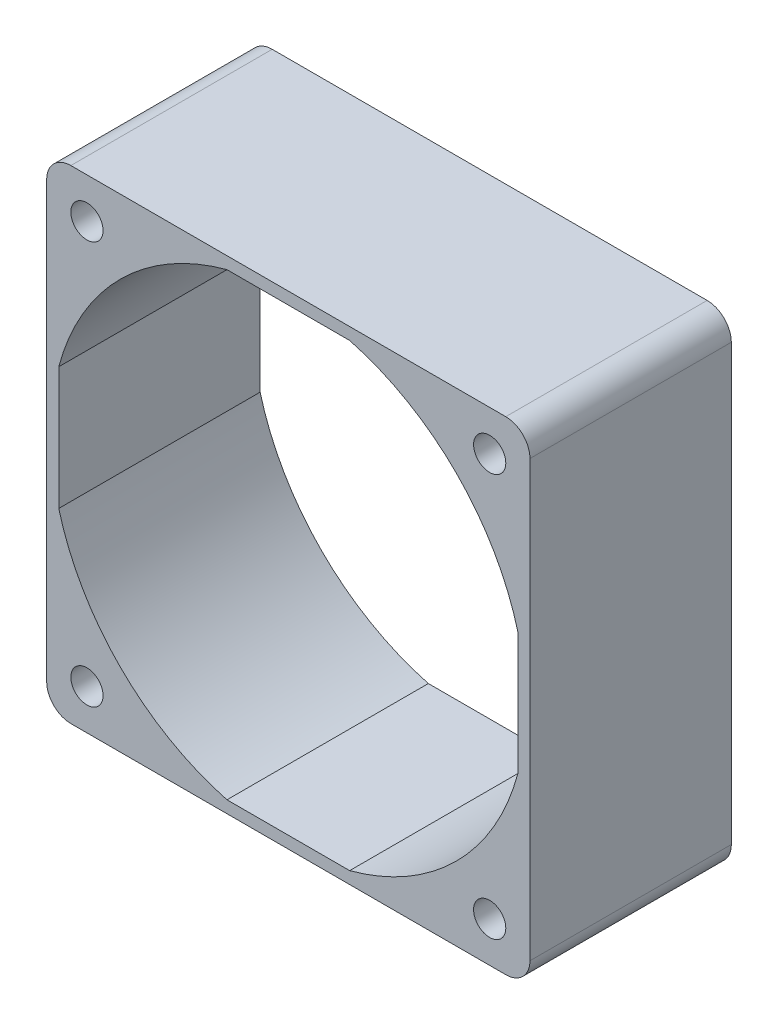
ISO-10303-21;
HEADER;
FILE_DESCRIPTION(('STEP AP214'),'2;1');
FILE_NAME('part.step','',(''),(''),'','','');
FILE_SCHEMA(('AUTOMOTIVE_DESIGN { 1 0 10303 214 1 1 1 1 }'));
ENDSEC;
DATA;
#1=APPLICATION_CONTEXT('core data for automotive mechanical design processes');
#2=APPLICATION_PROTOCOL_DEFINITION('international standard','automotive_design',2000,#1);
#3=PRODUCT_CONTEXT('',#1,'mechanical');
#4=PRODUCT('Part','Part','',(#3));
#5=PRODUCT_RELATED_PRODUCT_CATEGORY('part','',(#4));
#6=PRODUCT_DEFINITION_FORMATION('','',#4);
#7=PRODUCT_DEFINITION_CONTEXT('part definition',#1,'design');
#8=PRODUCT_DEFINITION('design','',#6,#7);
#9=PRODUCT_DEFINITION_SHAPE('','',#8);
#10=(LENGTH_UNIT() NAMED_UNIT(*) SI_UNIT(.MILLI.,.METRE.));
#11=(NAMED_UNIT(*) PLANE_ANGLE_UNIT() SI_UNIT($,.RADIAN.));
#12=(NAMED_UNIT(*) SI_UNIT($,.STERADIAN.) SOLID_ANGLE_UNIT());
#13=UNCERTAINTY_MEASURE_WITH_UNIT(LENGTH_MEASURE(1.E-05),#10,'distance_accuracy_value','');
#14=(GEOMETRIC_REPRESENTATION_CONTEXT(3) GLOBAL_UNCERTAINTY_ASSIGNED_CONTEXT((#13)) GLOBAL_UNIT_ASSIGNED_CONTEXT((#10,
#11,#12)) REPRESENTATION_CONTEXT('',''));
#15=CARTESIAN_POINT('',(0.,0.,0.));
#16=DIRECTION('',(0.,0.,1.));
#17=DIRECTION('',(1.,0.,0.));
#18=AXIS2_PLACEMENT_3D('',#15,#16,#17);
#19=CARTESIAN_POINT('',(-27.,-27.,25.));
#20=DIRECTION('',(0.,0.,-1.));
#21=DIRECTION('',(-1.,0.,0.));
#22=AXIS2_PLACEMENT_3D('',#19,#20,#21);
#23=PLANE('',#22);
#24=CARTESIAN_POINT('',(-27.,-27.,25.));
#25=DIRECTION('',(0.,0.,1.));
#26=DIRECTION('',(-1.,0.,0.));
#27=AXIS2_PLACEMENT_3D('',#24,#25,#26);
#28=CIRCLE('',#27,3.);
#29=CARTESIAN_POINT('',(-30.,-27.,25.));
#30=VERTEX_POINT('',#29);
#31=CARTESIAN_POINT('',(-27.,-30.,25.));
#32=VERTEX_POINT('',#31);
#33=EDGE_CURVE('E224',#30,#32,#28,.T.);
#34=ORIENTED_EDGE('',*,*,#33,.T.);
#35=DIRECTION('',(1.,0.,0.));
#36=VECTOR('',#35,1.);
#37=CARTESIAN_POINT('',(-27.,-30.,25.));
#38=LINE('',#37,#36);
#39=CARTESIAN_POINT('',(27.,-30.,25.));
#40=VERTEX_POINT('',#39);
#41=EDGE_CURVE('E227',#32,#40,#38,.T.);
#42=ORIENTED_EDGE('',*,*,#41,.T.);
#43=CARTESIAN_POINT('',(27.,-27.,25.));
#44=DIRECTION('',(0.,0.,1.));
#45=DIRECTION('',(1.,0.,0.));
#46=AXIS2_PLACEMENT_3D('',#43,#44,#45);
#47=CIRCLE('',#46,3.);
#48=CARTESIAN_POINT('',(30.,-27.,25.));
#49=VERTEX_POINT('',#48);
#50=EDGE_CURVE('E230',#40,#49,#47,.T.);
#51=ORIENTED_EDGE('',*,*,#50,.T.);
#52=DIRECTION('',(0.,1.,0.));
#53=VECTOR('',#52,1.);
#54=CARTESIAN_POINT('',(30.,27.,25.));
#55=LINE('',#54,#53);
#56=CARTESIAN_POINT('',(30.,27.,25.));
#57=VERTEX_POINT('',#56);
#58=EDGE_CURVE('E232',#49,#57,#55,.T.);
#59=ORIENTED_EDGE('',*,*,#58,.T.);
#60=CARTESIAN_POINT('',(27.,27.,25.));
#61=DIRECTION('',(0.,0.,1.));
#62=DIRECTION('',(1.,0.,0.));
#63=AXIS2_PLACEMENT_3D('',#60,#61,#62);
#64=CIRCLE('',#63,3.);
#65=CARTESIAN_POINT('',(27.,30.,25.));
#66=VERTEX_POINT('',#65);
#67=EDGE_CURVE('E234',#57,#66,#64,.T.);
#68=ORIENTED_EDGE('',*,*,#67,.T.);
#69=DIRECTION('',(-1.,0.,0.));
#70=VECTOR('',#69,1.);
#71=CARTESIAN_POINT('',(-27.,30.,25.));
#72=LINE('',#71,#70);
#73=CARTESIAN_POINT('',(-27.,30.,25.));
#74=VERTEX_POINT('',#73);
#75=EDGE_CURVE('E236',#66,#74,#72,.T.);
#76=ORIENTED_EDGE('',*,*,#75,.T.);
#77=CARTESIAN_POINT('',(-27.,27.,25.));
#78=DIRECTION('',(0.,0.,1.));
#79=DIRECTION('',(1.,0.,0.));
#80=AXIS2_PLACEMENT_3D('',#77,#78,#79);
#81=CIRCLE('',#80,3.);
#82=CARTESIAN_POINT('',(-30.,27.,25.));
#83=VERTEX_POINT('',#82);
#84=EDGE_CURVE('E238',#74,#83,#81,.T.);
#85=ORIENTED_EDGE('',*,*,#84,.T.);
#86=DIRECTION('',(0.,-1.,0.));
#87=VECTOR('',#86,1.);
#88=CARTESIAN_POINT('',(-30.,27.,25.));
#89=LINE('',#88,#87);
#90=EDGE_CURVE('E240',#83,#30,#89,.T.);
#91=ORIENTED_EDGE('',*,*,#90,.T.);
#92=EDGE_LOOP('',(#34,#42,#51,#59,#68,#76,#85,#91));
#93=FACE_BOUND('',#92,.T.);
#94=CARTESIAN_POINT('',(0.,0.,25.));
#95=DIRECTION('',(0.,0.,1.));
#96=DIRECTION('',(1.,0.,0.));
#97=AXIS2_PLACEMENT_3D('',#94,#95,#96);
#98=CIRCLE('',#97,29.5);
#99=CARTESIAN_POINT('',(7.61577310586391,-28.5,25.));
#100=VERTEX_POINT('',#99);
#101=CARTESIAN_POINT('',(28.5,-7.61577310586393,25.));
#102=VERTEX_POINT('',#101);
#103=EDGE_CURVE('E156',#100,#102,#98,.T.);
#104=ORIENTED_EDGE('',*,*,#103,.F.);
#105=DIRECTION('',(1.,0.,0.));
#106=VECTOR('',#105,1.);
#107=CARTESIAN_POINT('',(-7.61577310586391,-28.5,25.));
#108=LINE('',#107,#106);
#109=CARTESIAN_POINT('',(-7.6157731058639,-28.5,25.));
#110=VERTEX_POINT('',#109);
#111=EDGE_CURVE('E191',#110,#100,#108,.T.);
#112=ORIENTED_EDGE('',*,*,#111,.F.);
#113=CARTESIAN_POINT('',(0.,0.,25.));
#114=DIRECTION('',(0.,0.,1.));
#115=DIRECTION('',(1.,0.,0.));
#116=AXIS2_PLACEMENT_3D('',#113,#114,#115);
#117=CIRCLE('',#116,29.5);
#118=CARTESIAN_POINT('',(-28.5,-7.61577310586393,25.));
#119=VERTEX_POINT('',#118);
#120=EDGE_CURVE('E189',#119,#110,#117,.T.);
#121=ORIENTED_EDGE('',*,*,#120,.F.);
#122=DIRECTION('',(0.,-1.,0.));
#123=VECTOR('',#122,1.);
#124=CARTESIAN_POINT('',(-28.5,7.61577310586393,25.));
#125=LINE('',#124,#123);
#126=CARTESIAN_POINT('',(-28.5,7.61577310586393,25.));
#127=VERTEX_POINT('',#126);
#128=EDGE_CURVE('E187',#127,#119,#125,.T.);
#129=ORIENTED_EDGE('',*,*,#128,.F.);
#130=CARTESIAN_POINT('',(0.,0.,25.));
#131=DIRECTION('',(0.,0.,1.));
#132=DIRECTION('',(1.,0.,0.));
#133=AXIS2_PLACEMENT_3D('',#130,#131,#132);
#134=CIRCLE('',#133,29.5);
#135=CARTESIAN_POINT('',(-7.61577310586393,28.5,25.));
#136=VERTEX_POINT('',#135);
#137=EDGE_CURVE('E185',#136,#127,#134,.T.);
#138=ORIENTED_EDGE('',*,*,#137,.F.);
#139=DIRECTION('',(-1.,0.,0.));
#140=VECTOR('',#139,1.);
#141=CARTESIAN_POINT('',(-7.61577310586393,28.5,25.));
#142=LINE('',#141,#140);
#143=CARTESIAN_POINT('',(7.61577310586393,28.5,25.));
#144=VERTEX_POINT('',#143);
#145=EDGE_CURVE('E180',#144,#136,#142,.T.);
#146=ORIENTED_EDGE('',*,*,#145,.F.);
#147=CARTESIAN_POINT('',(0.,0.,25.));
#148=DIRECTION('',(0.,0.,1.));
#149=DIRECTION('',(1.,0.,0.));
#150=AXIS2_PLACEMENT_3D('',#147,#148,#149);
#151=CIRCLE('',#150,29.5);
#152=CARTESIAN_POINT('',(28.5,7.61577310586393,25.));
#153=VERTEX_POINT('',#152);
#154=EDGE_CURVE('E178',#153,#144,#151,.T.);
#155=ORIENTED_EDGE('',*,*,#154,.F.);
#156=DIRECTION('',(0.,1.,0.));
#157=VECTOR('',#156,1.);
#158=CARTESIAN_POINT('',(28.5,7.61577310586393,25.));
#159=LINE('',#158,#157);
#160=EDGE_CURVE('E164',#102,#153,#159,.T.);
#161=ORIENTED_EDGE('',*,*,#160,.F.);
#162=EDGE_LOOP('',(#104,#112,#121,#129,#138,#146,#155,#161));
#163=FACE_BOUND('',#162,.T.);
#164=CARTESIAN_POINT('',(-25.,25.,25.));
#165=DIRECTION('',(0.,0.,1.));
#166=DIRECTION('',(1.,0.,0.));
#167=AXIS2_PLACEMENT_3D('',#164,#165,#166);
#168=CIRCLE('',#167,2.);
#169=CARTESIAN_POINT('',(-23.,25.,25.));
#170=VERTEX_POINT('',#169);
#171=EDGE_CURVE('E194',#170,#170,#168,.T.);
#172=ORIENTED_EDGE('',*,*,#171,.F.);
#173=EDGE_LOOP('',(#172));
#174=FACE_BOUND('',#173,.T.);
#175=CARTESIAN_POINT('',(25.,25.,25.));
#176=DIRECTION('',(0.,0.,1.));
#177=DIRECTION('',(1.,0.,0.));
#178=AXIS2_PLACEMENT_3D('',#175,#176,#177);
#179=CIRCLE('',#178,2.);
#180=CARTESIAN_POINT('',(27.,25.,25.));
#181=VERTEX_POINT('',#180);
#182=EDGE_CURVE('E402',#181,#181,#179,.T.);
#183=ORIENTED_EDGE('',*,*,#182,.F.);
#184=EDGE_LOOP('',(#183));
#185=FACE_BOUND('',#184,.T.);
#186=CARTESIAN_POINT('',(25.,-25.,25.));
#187=DIRECTION('',(0.,0.,1.));
#188=DIRECTION('',(1.,0.,0.));
#189=AXIS2_PLACEMENT_3D('',#186,#187,#188);
#190=CIRCLE('',#189,2.);
#191=CARTESIAN_POINT('',(27.,-25.,25.));
#192=VERTEX_POINT('',#191);
#193=EDGE_CURVE('E396',#192,#192,#190,.T.);
#194=ORIENTED_EDGE('',*,*,#193,.F.);
#195=EDGE_LOOP('',(#194));
#196=FACE_BOUND('',#195,.T.);
#197=CARTESIAN_POINT('',(-25.,-25.,25.));
#198=DIRECTION('',(0.,0.,1.));
#199=DIRECTION('',(1.,0.,0.));
#200=AXIS2_PLACEMENT_3D('',#197,#198,#199);
#201=CIRCLE('',#200,2.00000000000001);
#202=CARTESIAN_POINT('',(-23.,-25.,25.));
#203=VERTEX_POINT('',#202);
#204=EDGE_CURVE('E387',#203,#203,#201,.T.);
#205=ORIENTED_EDGE('',*,*,#204,.F.);
#206=EDGE_LOOP('',(#205));
#207=FACE_BOUND('',#206,.T.);
#208=ADVANCED_FACE('F43',(#93,#163,#174,#185,#196,#207),#23,.F.);
#209=CARTESIAN_POINT('',(-27.,-27.,0.));
#210=DIRECTION('',(0.,0.,-1.));
#211=DIRECTION('',(-1.,0.,0.));
#212=AXIS2_PLACEMENT_3D('',#209,#210,#211);
#213=PLANE('',#212);
#214=CARTESIAN_POINT('',(25.,-25.,0.));
#215=DIRECTION('',(0.,0.,1.));
#216=DIRECTION('',(1.,0.,0.));
#217=AXIS2_PLACEMENT_3D('',#214,#215,#216);
#218=CIRCLE('',#217,2.);
#219=CARTESIAN_POINT('',(27.,-25.,0.));
#220=VERTEX_POINT('',#219);
#221=EDGE_CURVE('E393',#220,#220,#218,.T.);
#222=ORIENTED_EDGE('',*,*,#221,.T.);
#223=EDGE_LOOP('',(#222));
#224=FACE_BOUND('',#223,.T.);
#225=CARTESIAN_POINT('',(-25.,25.,0.));
#226=DIRECTION('',(0.,0.,1.));
#227=DIRECTION('',(1.,0.,0.));
#228=AXIS2_PLACEMENT_3D('',#225,#226,#227);
#229=CIRCLE('',#228,2.);
#230=CARTESIAN_POINT('',(-23.,25.,0.));
#231=VERTEX_POINT('',#230);
#232=EDGE_CURVE('E405',#231,#231,#229,.T.);
#233=ORIENTED_EDGE('',*,*,#232,.T.);
#234=EDGE_LOOP('',(#233));
#235=FACE_BOUND('',#234,.T.);
#236=CARTESIAN_POINT('',(-27.,-27.,0.));
#237=DIRECTION('',(0.,0.,1.));
#238=DIRECTION('',(-1.,0.,0.));
#239=AXIS2_PLACEMENT_3D('',#236,#237,#238);
#240=CIRCLE('',#239,3.);
#241=CARTESIAN_POINT('',(-30.,-27.,0.));
#242=VERTEX_POINT('',#241);
#243=CARTESIAN_POINT('',(-27.,-30.,0.));
#244=VERTEX_POINT('',#243);
#245=EDGE_CURVE('E172',#242,#244,#240,.T.);
#246=ORIENTED_EDGE('',*,*,#245,.F.);
#247=DIRECTION('',(0.,-1.,0.));
#248=VECTOR('',#247,1.);
#249=CARTESIAN_POINT('',(-30.,27.,0.));
#250=LINE('',#249,#248);
#251=CARTESIAN_POINT('',(-30.,27.,0.));
#252=VERTEX_POINT('',#251);
#253=EDGE_CURVE('E228',#252,#242,#250,.T.);
#254=ORIENTED_EDGE('',*,*,#253,.F.);
#255=CARTESIAN_POINT('',(-27.,27.,0.));
#256=DIRECTION('',(0.,0.,1.));
#257=DIRECTION('',(1.,0.,0.));
#258=AXIS2_PLACEMENT_3D('',#255,#256,#257);
#259=CIRCLE('',#258,3.);
#260=CARTESIAN_POINT('',(-27.,30.,0.));
#261=VERTEX_POINT('',#260);
#262=EDGE_CURVE('E255',#261,#252,#259,.T.);
#263=ORIENTED_EDGE('',*,*,#262,.F.);
#264=DIRECTION('',(-1.,0.,0.));
#265=VECTOR('',#264,1.);
#266=CARTESIAN_POINT('',(-27.,30.,0.));
#267=LINE('',#266,#265);
#268=CARTESIAN_POINT('',(27.,30.,0.));
#269=VERTEX_POINT('',#268);
#270=EDGE_CURVE('E253',#269,#261,#267,.T.);
#271=ORIENTED_EDGE('',*,*,#270,.F.);
#272=CARTESIAN_POINT('',(27.,27.,0.));
#273=DIRECTION('',(0.,0.,1.));
#274=DIRECTION('',(1.,0.,0.));
#275=AXIS2_PLACEMENT_3D('',#272,#273,#274);
#276=CIRCLE('',#275,3.);
#277=CARTESIAN_POINT('',(30.,27.,0.));
#278=VERTEX_POINT('',#277);
#279=EDGE_CURVE('E251',#278,#269,#276,.T.);
#280=ORIENTED_EDGE('',*,*,#279,.F.);
#281=DIRECTION('',(0.,1.,0.));
#282=VECTOR('',#281,1.);
#283=CARTESIAN_POINT('',(30.,27.,0.));
#284=LINE('',#283,#282);
#285=CARTESIAN_POINT('',(30.,-27.,0.));
#286=VERTEX_POINT('',#285);
#287=EDGE_CURVE('E249',#286,#278,#284,.T.);
#288=ORIENTED_EDGE('',*,*,#287,.F.);
#289=CARTESIAN_POINT('',(27.,-27.,0.));
#290=DIRECTION('',(0.,0.,1.));
#291=DIRECTION('',(1.,0.,0.));
#292=AXIS2_PLACEMENT_3D('',#289,#290,#291);
#293=CIRCLE('',#292,3.);
#294=CARTESIAN_POINT('',(27.,-30.,0.));
#295=VERTEX_POINT('',#294);
#296=EDGE_CURVE('E247',#295,#286,#293,.T.);
#297=ORIENTED_EDGE('',*,*,#296,.F.);
#298=DIRECTION('',(1.,0.,0.));
#299=VECTOR('',#298,1.);
#300=CARTESIAN_POINT('',(-27.,-30.,0.));
#301=LINE('',#300,#299);
#302=EDGE_CURVE('E245',#244,#295,#301,.T.);
#303=ORIENTED_EDGE('',*,*,#302,.F.);
#304=EDGE_LOOP('',(#246,#254,#263,#271,#280,#288,#297,#303));
#305=FACE_BOUND('',#304,.T.);
#306=DIRECTION('',(1.,0.,0.));
#307=VECTOR('',#306,1.);
#308=CARTESIAN_POINT('',(-7.61577310586391,-28.5,0.));
#309=LINE('',#308,#307);
#310=CARTESIAN_POINT('',(-7.61577310586391,-28.5,0.));
#311=VERTEX_POINT('',#310);
#312=CARTESIAN_POINT('',(7.61577310586391,-28.5,0.));
#313=VERTEX_POINT('',#312);
#314=EDGE_CURVE('E165',#311,#313,#309,.T.);
#315=ORIENTED_EDGE('',*,*,#314,.T.);
#316=CARTESIAN_POINT('',(0.,0.,0.));
#317=DIRECTION('',(0.,0.,1.));
#318=DIRECTION('',(1.,0.,0.));
#319=AXIS2_PLACEMENT_3D('',#316,#317,#318);
#320=CIRCLE('',#319,29.5);
#321=CARTESIAN_POINT('',(28.5,-7.61577310586393,0.));
#322=VERTEX_POINT('',#321);
#323=EDGE_CURVE('E66',#313,#322,#320,.T.);
#324=ORIENTED_EDGE('',*,*,#323,.T.);
#325=DIRECTION('',(0.,1.,0.));
#326=VECTOR('',#325,1.);
#327=CARTESIAN_POINT('',(28.5,7.61577310586393,0.));
#328=LINE('',#327,#326);
#329=CARTESIAN_POINT('',(28.5,7.61577310586393,0.));
#330=VERTEX_POINT('',#329);
#331=EDGE_CURVE('E171',#322,#330,#328,.T.);
#332=ORIENTED_EDGE('',*,*,#331,.T.);
#333=CARTESIAN_POINT('',(0.,0.,0.));
#334=DIRECTION('',(0.,0.,1.));
#335=DIRECTION('',(1.,0.,0.));
#336=AXIS2_PLACEMENT_3D('',#333,#334,#335);
#337=CIRCLE('',#336,29.5);
#338=CARTESIAN_POINT('',(7.61577310586393,28.5,0.));
#339=VERTEX_POINT('',#338);
#340=EDGE_CURVE('E196',#330,#339,#337,.T.);
#341=ORIENTED_EDGE('',*,*,#340,.T.);
#342=DIRECTION('',(-1.,0.,0.));
#343=VECTOR('',#342,1.);
#344=CARTESIAN_POINT('',(-7.61577310586393,28.5,0.));
#345=LINE('',#344,#343);
#346=CARTESIAN_POINT('',(-7.61577310586393,28.5,0.));
#347=VERTEX_POINT('',#346);
#348=EDGE_CURVE('E199',#339,#347,#345,.T.);
#349=ORIENTED_EDGE('',*,*,#348,.T.);
#350=CARTESIAN_POINT('',(0.,0.,0.));
#351=DIRECTION('',(0.,0.,1.));
#352=DIRECTION('',(1.,0.,0.));
#353=AXIS2_PLACEMENT_3D('',#350,#351,#352);
#354=CIRCLE('',#353,29.5);
#355=CARTESIAN_POINT('',(-28.5,7.61577310586393,0.));
#356=VERTEX_POINT('',#355);
#357=EDGE_CURVE('E202',#347,#356,#354,.T.);
#358=ORIENTED_EDGE('',*,*,#357,.T.);
#359=DIRECTION('',(0.,-1.,0.));
#360=VECTOR('',#359,1.);
#361=CARTESIAN_POINT('',(-28.5,7.61577310586393,0.));
#362=LINE('',#361,#360);
#363=CARTESIAN_POINT('',(-28.5,-7.61577310586393,0.));
#364=VERTEX_POINT('',#363);
#365=EDGE_CURVE('E205',#356,#364,#362,.T.);
#366=ORIENTED_EDGE('',*,*,#365,.T.);
#367=CARTESIAN_POINT('',(0.,0.,0.));
#368=DIRECTION('',(0.,0.,1.));
#369=DIRECTION('',(1.,0.,0.));
#370=AXIS2_PLACEMENT_3D('',#367,#368,#369);
#371=CIRCLE('',#370,29.5);
#372=EDGE_CURVE('E208',#364,#311,#371,.T.);
#373=ORIENTED_EDGE('',*,*,#372,.T.);
#374=EDGE_LOOP('',(#315,#324,#332,#341,#349,#358,#366,#373));
#375=FACE_BOUND('',#374,.T.);
#376=CARTESIAN_POINT('',(25.,25.,0.));
#377=DIRECTION('',(0.,0.,1.));
#378=DIRECTION('',(1.,0.,0.));
#379=AXIS2_PLACEMENT_3D('',#376,#377,#378);
#380=CIRCLE('',#379,2.);
#381=CARTESIAN_POINT('',(27.,25.,0.));
#382=VERTEX_POINT('',#381);
#383=EDGE_CURVE('E399',#382,#382,#380,.T.);
#384=ORIENTED_EDGE('',*,*,#383,.T.);
#385=EDGE_LOOP('',(#384));
#386=FACE_BOUND('',#385,.T.);
#387=CARTESIAN_POINT('',(-25.,-25.,0.));
#388=DIRECTION('',(0.,0.,1.));
#389=DIRECTION('',(1.,0.,0.));
#390=AXIS2_PLACEMENT_3D('',#387,#388,#389);
#391=CIRCLE('',#390,2.00000000000001);
#392=CARTESIAN_POINT('',(-23.,-25.,0.));
#393=VERTEX_POINT('',#392);
#394=EDGE_CURVE('E390',#393,#393,#391,.T.);
#395=ORIENTED_EDGE('',*,*,#394,.T.);
#396=EDGE_LOOP('',(#395));
#397=FACE_BOUND('',#396,.T.);
#398=ADVANCED_FACE('F285',(#224,#235,#305,#375,#386,#397),#213,.T.);
#399=CARTESIAN_POINT('',(-27.,-27.,25.));
#400=DIRECTION('',(0.,0.,-1.));
#401=DIRECTION('',(-1.,0.,0.));
#402=AXIS2_PLACEMENT_3D('',#399,#400,#401);
#403=CYLINDRICAL_SURFACE('',#402,3.);
#404=ORIENTED_EDGE('',*,*,#245,.T.);
#405=DIRECTION('',(0.,0.,-1.));
#406=VECTOR('',#405,1.);
#407=CARTESIAN_POINT('',(-27.,-30.,25.));
#408=LINE('',#407,#406);
#409=EDGE_CURVE('E11',#32,#244,#408,.T.);
#410=ORIENTED_EDGE('',*,*,#409,.F.);
#411=ORIENTED_EDGE('',*,*,#33,.F.);
#412=DIRECTION('',(0.,0.,-1.));
#413=VECTOR('',#412,1.);
#414=CARTESIAN_POINT('',(-30.,-27.,25.));
#415=LINE('',#414,#413);
#416=EDGE_CURVE('E242',#30,#242,#415,.T.);
#417=ORIENTED_EDGE('',*,*,#416,.T.);
#418=EDGE_LOOP('',(#404,#410,#411,#417));
#419=FACE_BOUND('',#418,.T.);
#420=ADVANCED_FACE('F45',(#419),#403,.T.);
#421=CARTESIAN_POINT('',(-27.,-30.,25.));
#422=DIRECTION('',(0.,1.,0.));
#423=DIRECTION('',(-1.,0.,0.));
#424=AXIS2_PLACEMENT_3D('',#421,#422,#423);
#425=PLANE('',#424);
#426=ORIENTED_EDGE('',*,*,#302,.T.);
#427=DIRECTION('',(0.,0.,-1.));
#428=VECTOR('',#427,1.);
#429=CARTESIAN_POINT('',(27.,-30.,25.));
#430=LINE('',#429,#428);
#431=EDGE_CURVE('E51',#40,#295,#430,.T.);
#432=ORIENTED_EDGE('',*,*,#431,.F.);
#433=ORIENTED_EDGE('',*,*,#41,.F.);
#434=ORIENTED_EDGE('',*,*,#409,.T.);
#435=EDGE_LOOP('',(#426,#432,#433,#434));
#436=FACE_BOUND('',#435,.T.);
#437=ADVANCED_FACE('F302',(#436),#425,.F.);
#438=CARTESIAN_POINT('',(27.,-27.,25.));
#439=DIRECTION('',(0.,0.,-1.));
#440=DIRECTION('',(-1.,0.,0.));
#441=AXIS2_PLACEMENT_3D('',#438,#439,#440);
#442=CYLINDRICAL_SURFACE('',#441,3.);
#443=ORIENTED_EDGE('',*,*,#296,.T.);
#444=DIRECTION('',(0.,0.,-1.));
#445=VECTOR('',#444,1.);
#446=CARTESIAN_POINT('',(30.,-27.,25.));
#447=LINE('',#446,#445);
#448=EDGE_CURVE('E272',#49,#286,#447,.T.);
#449=ORIENTED_EDGE('',*,*,#448,.F.);
#450=ORIENTED_EDGE('',*,*,#50,.F.);
#451=ORIENTED_EDGE('',*,*,#431,.T.);
#452=EDGE_LOOP('',(#443,#449,#450,#451));
#453=FACE_BOUND('',#452,.T.);
#454=ADVANCED_FACE('F279',(#453),#442,.T.);
#455=CARTESIAN_POINT('',(30.,27.,25.));
#456=DIRECTION('',(-1.,0.,0.));
#457=DIRECTION('',(0.,0.,1.));
#458=AXIS2_PLACEMENT_3D('',#455,#456,#457);
#459=PLANE('',#458);
#460=ORIENTED_EDGE('',*,*,#287,.T.);
#461=DIRECTION('',(0.,0.,-1.));
#462=VECTOR('',#461,1.);
#463=CARTESIAN_POINT('',(30.,27.,25.));
#464=LINE('',#463,#462);
#465=EDGE_CURVE('E269',#57,#278,#464,.T.);
#466=ORIENTED_EDGE('',*,*,#465,.F.);
#467=ORIENTED_EDGE('',*,*,#58,.F.);
#468=ORIENTED_EDGE('',*,*,#448,.T.);
#469=EDGE_LOOP('',(#460,#466,#467,#468));
#470=FACE_BOUND('',#469,.T.);
#471=ADVANCED_FACE('F291',(#470),#459,.F.);
#472=CARTESIAN_POINT('',(27.,27.,25.));
#473=DIRECTION('',(0.,0.,-1.));
#474=DIRECTION('',(-1.,0.,0.));
#475=AXIS2_PLACEMENT_3D('',#472,#473,#474);
#476=CYLINDRICAL_SURFACE('',#475,3.);
#477=ORIENTED_EDGE('',*,*,#279,.T.);
#478=DIRECTION('',(0.,0.,-1.));
#479=VECTOR('',#478,1.);
#480=CARTESIAN_POINT('',(27.,30.,25.));
#481=LINE('',#480,#479);
#482=EDGE_CURVE('E266',#66,#269,#481,.T.);
#483=ORIENTED_EDGE('',*,*,#482,.F.);
#484=ORIENTED_EDGE('',*,*,#67,.F.);
#485=ORIENTED_EDGE('',*,*,#465,.T.);
#486=EDGE_LOOP('',(#477,#483,#484,#485));
#487=FACE_BOUND('',#486,.T.);
#488=ADVANCED_FACE('F295',(#487),#476,.T.);
#489=CARTESIAN_POINT('',(-27.,30.,25.));
#490=DIRECTION('',(0.,-1.,0.));
#491=DIRECTION('',(1.,0.,0.));
#492=AXIS2_PLACEMENT_3D('',#489,#490,#491);
#493=PLANE('',#492);
#494=ORIENTED_EDGE('',*,*,#270,.T.);
#495=DIRECTION('',(0.,0.,-1.));
#496=VECTOR('',#495,1.);
#497=CARTESIAN_POINT('',(-27.,30.,25.));
#498=LINE('',#497,#496);
#499=EDGE_CURVE('E263',#74,#261,#498,.T.);
#500=ORIENTED_EDGE('',*,*,#499,.F.);
#501=ORIENTED_EDGE('',*,*,#75,.F.);
#502=ORIENTED_EDGE('',*,*,#482,.T.);
#503=EDGE_LOOP('',(#494,#500,#501,#502));
#504=FACE_BOUND('',#503,.T.);
#505=ADVANCED_FACE('F315',(#504),#493,.F.);
#506=CARTESIAN_POINT('',(-27.,27.,25.));
#507=DIRECTION('',(0.,0.,-1.));
#508=DIRECTION('',(-1.,0.,0.));
#509=AXIS2_PLACEMENT_3D('',#506,#507,#508);
#510=CYLINDRICAL_SURFACE('',#509,3.);
#511=ORIENTED_EDGE('',*,*,#262,.T.);
#512=DIRECTION('',(0.,0.,-1.));
#513=VECTOR('',#512,1.);
#514=CARTESIAN_POINT('',(-30.,27.,25.));
#515=LINE('',#514,#513);
#516=EDGE_CURVE('E260',#83,#252,#515,.T.);
#517=ORIENTED_EDGE('',*,*,#516,.F.);
#518=ORIENTED_EDGE('',*,*,#84,.F.);
#519=ORIENTED_EDGE('',*,*,#499,.T.);
#520=EDGE_LOOP('',(#511,#517,#518,#519));
#521=FACE_BOUND('',#520,.T.);
#522=ADVANCED_FACE('F313',(#521),#510,.T.);
#523=CARTESIAN_POINT('',(-30.,27.,25.));
#524=DIRECTION('',(1.,0.,0.));
#525=DIRECTION('',(0.,0.,-1.));
#526=AXIS2_PLACEMENT_3D('',#523,#524,#525);
#527=PLANE('',#526);
#528=ORIENTED_EDGE('',*,*,#253,.T.);
#529=ORIENTED_EDGE('',*,*,#416,.F.);
#530=ORIENTED_EDGE('',*,*,#90,.F.);
#531=ORIENTED_EDGE('',*,*,#516,.T.);
#532=EDGE_LOOP('',(#528,#529,#530,#531));
#533=FACE_BOUND('',#532,.T.);
#534=ADVANCED_FACE('F308',(#533),#527,.F.);
#535=CARTESIAN_POINT('',(0.,0.,25.));
#536=DIRECTION('',(0.,0.,-1.));
#537=DIRECTION('',(-1.,0.,0.));
#538=AXIS2_PLACEMENT_3D('',#535,#536,#537);
#539=CYLINDRICAL_SURFACE('',#538,29.5);
#540=ORIENTED_EDGE('',*,*,#323,.F.);
#541=DIRECTION('',(0.,0.,-1.));
#542=VECTOR('',#541,1.);
#543=CARTESIAN_POINT('',(7.61577310586391,-28.5,25.));
#544=LINE('',#543,#542);
#545=EDGE_CURVE('E160',#100,#313,#544,.T.);
#546=ORIENTED_EDGE('',*,*,#545,.F.);
#547=ORIENTED_EDGE('',*,*,#103,.T.);
#548=DIRECTION('',(0.,0.,-1.));
#549=VECTOR('',#548,1.);
#550=CARTESIAN_POINT('',(28.5,-7.61577310586393,25.));
#551=LINE('',#550,#549);
#552=EDGE_CURVE('E159',#102,#322,#551,.T.);
#553=ORIENTED_EDGE('',*,*,#552,.T.);
#554=EDGE_LOOP('',(#540,#546,#547,#553));
#555=FACE_BOUND('',#554,.T.);
#556=ADVANCED_FACE('F158',(#555),#539,.F.);
#557=CARTESIAN_POINT('',(28.5,7.61577310586393,25.));
#558=DIRECTION('',(-1.,0.,0.));
#559=DIRECTION('',(0.,0.,1.));
#560=AXIS2_PLACEMENT_3D('',#557,#558,#559);
#561=PLANE('',#560);
#562=ORIENTED_EDGE('',*,*,#331,.F.);
#563=ORIENTED_EDGE('',*,*,#552,.F.);
#564=ORIENTED_EDGE('',*,*,#160,.T.);
#565=DIRECTION('',(0.,0.,-1.));
#566=VECTOR('',#565,1.);
#567=CARTESIAN_POINT('',(28.5,7.61577310586393,25.));
#568=LINE('',#567,#566);
#569=EDGE_CURVE('E173',#153,#330,#568,.T.);
#570=ORIENTED_EDGE('',*,*,#569,.T.);
#571=EDGE_LOOP('',(#562,#563,#564,#570));
#572=FACE_BOUND('',#571,.T.);
#573=ADVANCED_FACE('F168',(#572),#561,.T.);
#574=CARTESIAN_POINT('',(0.,0.,25.));
#575=DIRECTION('',(0.,0.,-1.));
#576=DIRECTION('',(-1.,0.,0.));
#577=AXIS2_PLACEMENT_3D('',#574,#575,#576);
#578=CYLINDRICAL_SURFACE('',#577,29.5);
#579=ORIENTED_EDGE('',*,*,#340,.F.);
#580=ORIENTED_EDGE('',*,*,#569,.F.);
#581=ORIENTED_EDGE('',*,*,#154,.T.);
#582=DIRECTION('',(0.,0.,-1.));
#583=VECTOR('',#582,1.);
#584=CARTESIAN_POINT('',(7.61577310586393,28.5,25.));
#585=LINE('',#584,#583);
#586=EDGE_CURVE('E221',#144,#339,#585,.T.);
#587=ORIENTED_EDGE('',*,*,#586,.T.);
#588=EDGE_LOOP('',(#579,#580,#581,#587));
#589=FACE_BOUND('',#588,.T.);
#590=ADVANCED_FACE('F341',(#589),#578,.F.);
#591=CARTESIAN_POINT('',(-7.61577310586393,28.5,25.));
#592=DIRECTION('',(0.,-1.,0.));
#593=DIRECTION('',(0.,0.,-1.));
#594=AXIS2_PLACEMENT_3D('',#591,#592,#593);
#595=PLANE('',#594);
#596=ORIENTED_EDGE('',*,*,#348,.F.);
#597=ORIENTED_EDGE('',*,*,#586,.F.);
#598=ORIENTED_EDGE('',*,*,#145,.T.);
#599=DIRECTION('',(0.,0.,-1.));
#600=VECTOR('',#599,1.);
#601=CARTESIAN_POINT('',(-7.61577310586393,28.5,25.));
#602=LINE('',#601,#600);
#603=EDGE_CURVE('E219',#136,#347,#602,.T.);
#604=ORIENTED_EDGE('',*,*,#603,.T.);
#605=EDGE_LOOP('',(#596,#597,#598,#604));
#606=FACE_BOUND('',#605,.T.);
#607=ADVANCED_FACE('F345',(#606),#595,.T.);
#608=CARTESIAN_POINT('',(0.,0.,25.));
#609=DIRECTION('',(0.,0.,-1.));
#610=DIRECTION('',(-1.,0.,0.));
#611=AXIS2_PLACEMENT_3D('',#608,#609,#610);
#612=CYLINDRICAL_SURFACE('',#611,29.5);
#613=ORIENTED_EDGE('',*,*,#357,.F.);
#614=ORIENTED_EDGE('',*,*,#603,.F.);
#615=ORIENTED_EDGE('',*,*,#137,.T.);
#616=DIRECTION('',(0.,0.,-1.));
#617=VECTOR('',#616,1.);
#618=CARTESIAN_POINT('',(-28.5,7.61577310586393,25.));
#619=LINE('',#618,#617);
#620=EDGE_CURVE('E217',#127,#356,#619,.T.);
#621=ORIENTED_EDGE('',*,*,#620,.T.);
#622=EDGE_LOOP('',(#613,#614,#615,#621));
#623=FACE_BOUND('',#622,.T.);
#624=ADVANCED_FACE('F351',(#623),#612,.F.);
#625=CARTESIAN_POINT('',(-28.5,7.61577310586393,25.));
#626=DIRECTION('',(1.,0.,0.));
#627=DIRECTION('',(0.,0.,-1.));
#628=AXIS2_PLACEMENT_3D('',#625,#626,#627);
#629=PLANE('',#628);
#630=ORIENTED_EDGE('',*,*,#365,.F.);
#631=ORIENTED_EDGE('',*,*,#620,.F.);
#632=ORIENTED_EDGE('',*,*,#128,.T.);
#633=DIRECTION('',(0.,0.,-1.));
#634=VECTOR('',#633,1.);
#635=CARTESIAN_POINT('',(-28.5,-7.61577310586393,25.));
#636=LINE('',#635,#634);
#637=EDGE_CURVE('E215',#119,#364,#636,.T.);
#638=ORIENTED_EDGE('',*,*,#637,.T.);
#639=EDGE_LOOP('',(#630,#631,#632,#638));
#640=FACE_BOUND('',#639,.T.);
#641=ADVANCED_FACE('F355',(#640),#629,.T.);
#642=CARTESIAN_POINT('',(0.,0.,25.));
#643=DIRECTION('',(0.,0.,-1.));
#644=DIRECTION('',(-1.,0.,0.));
#645=AXIS2_PLACEMENT_3D('',#642,#643,#644);
#646=CYLINDRICAL_SURFACE('',#645,29.5);
#647=ORIENTED_EDGE('',*,*,#372,.F.);
#648=ORIENTED_EDGE('',*,*,#637,.F.);
#649=ORIENTED_EDGE('',*,*,#120,.T.);
#650=DIRECTION('',(0.,0.,-1.));
#651=VECTOR('',#650,1.);
#652=CARTESIAN_POINT('',(-7.61577310586391,-28.5,25.));
#653=LINE('',#652,#651);
#654=EDGE_CURVE('E58',#110,#311,#653,.T.);
#655=ORIENTED_EDGE('',*,*,#654,.T.);
#656=EDGE_LOOP('',(#647,#648,#649,#655));
#657=FACE_BOUND('',#656,.T.);
#658=ADVANCED_FACE('F359',(#657),#646,.F.);
#659=CARTESIAN_POINT('',(-7.61577310586391,-28.5,25.));
#660=DIRECTION('',(0.,1.,0.));
#661=DIRECTION('',(0.,0.,1.));
#662=AXIS2_PLACEMENT_3D('',#659,#660,#661);
#663=PLANE('',#662);
#664=ORIENTED_EDGE('',*,*,#314,.F.);
#665=ORIENTED_EDGE('',*,*,#654,.F.);
#666=ORIENTED_EDGE('',*,*,#111,.T.);
#667=ORIENTED_EDGE('',*,*,#545,.T.);
#668=EDGE_LOOP('',(#664,#665,#666,#667));
#669=FACE_BOUND('',#668,.T.);
#670=ADVANCED_FACE('F363',(#669),#663,.T.);
#671=CARTESIAN_POINT('',(-25.,25.,25.));
#672=DIRECTION('',(0.,0.,-1.));
#673=DIRECTION('',(-1.,0.,0.));
#674=AXIS2_PLACEMENT_3D('',#671,#672,#673);
#675=CYLINDRICAL_SURFACE('',#674,2.);
#676=ORIENTED_EDGE('',*,*,#171,.T.);
#677=EDGE_LOOP('',(#676));
#678=FACE_BOUND('',#677,.T.);
#679=ORIENTED_EDGE('',*,*,#232,.F.);
#680=EDGE_LOOP('',(#679));
#681=FACE_BOUND('',#680,.T.);
#682=ADVANCED_FACE('F367',(#678,#681),#675,.F.);
#683=CARTESIAN_POINT('',(25.,25.,25.));
#684=DIRECTION('',(0.,0.,-1.));
#685=DIRECTION('',(-1.,0.,0.));
#686=AXIS2_PLACEMENT_3D('',#683,#684,#685);
#687=CYLINDRICAL_SURFACE('',#686,2.);
#688=ORIENTED_EDGE('',*,*,#182,.T.);
#689=EDGE_LOOP('',(#688));
#690=FACE_BOUND('',#689,.T.);
#691=ORIENTED_EDGE('',*,*,#383,.F.);
#692=EDGE_LOOP('',(#691));
#693=FACE_BOUND('',#692,.T.);
#694=ADVANCED_FACE('F370',(#690,#693),#687,.F.);
#695=CARTESIAN_POINT('',(25.,-25.,25.));
#696=DIRECTION('',(0.,0.,-1.));
#697=DIRECTION('',(-1.,0.,0.));
#698=AXIS2_PLACEMENT_3D('',#695,#696,#697);
#699=CYLINDRICAL_SURFACE('',#698,2.);
#700=ORIENTED_EDGE('',*,*,#193,.T.);
#701=EDGE_LOOP('',(#700));
#702=FACE_BOUND('',#701,.T.);
#703=ORIENTED_EDGE('',*,*,#221,.F.);
#704=EDGE_LOOP('',(#703));
#705=FACE_BOUND('',#704,.T.);
#706=ADVANCED_FACE('F374',(#702,#705),#699,.F.);
#707=CARTESIAN_POINT('',(-25.,-25.,25.));
#708=DIRECTION('',(0.,0.,-1.));
#709=DIRECTION('',(-1.,0.,0.));
#710=AXIS2_PLACEMENT_3D('',#707,#708,#709);
#711=CYLINDRICAL_SURFACE('',#710,2.00000000000001);
#712=ORIENTED_EDGE('',*,*,#204,.T.);
#713=EDGE_LOOP('',(#712));
#714=FACE_BOUND('',#713,.T.);
#715=ORIENTED_EDGE('',*,*,#394,.F.);
#716=EDGE_LOOP('',(#715));
#717=FACE_BOUND('',#716,.T.);
#718=ADVANCED_FACE('F378',(#714,#717),#711,.F.);
#719=CLOSED_SHELL('',(#208,#398,#420,#437,#454,#471,#488,#505,#522,#534,#556,#573,#590,#607,
#624,#641,#658,#670,#682,#694,#706,#718));
#720=MANIFOLD_SOLID_BREP('B2',#719);
#721=ADVANCED_BREP_SHAPE_REPRESENTATION('',(#18,#720),#14);
#722=SHAPE_DEFINITION_REPRESENTATION(#9,#721);
ENDSEC;
END-ISO-10303-21;
